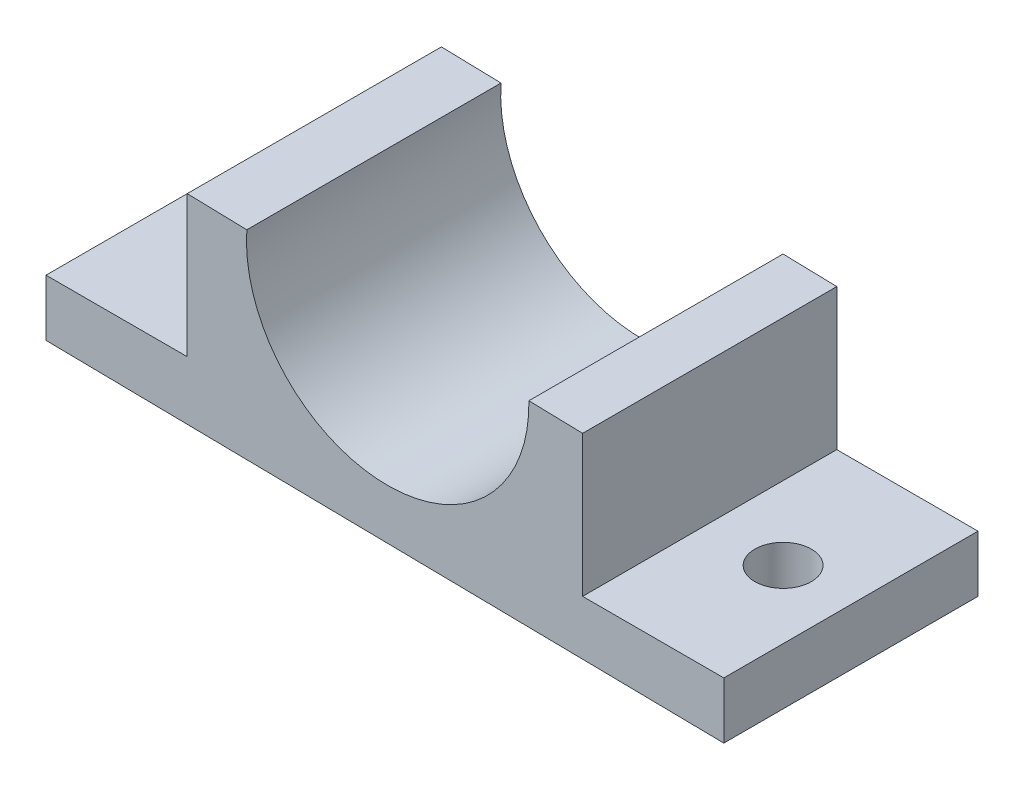
ISO-10303-21;
HEADER;
FILE_DESCRIPTION(('STEP AP214'),'2;1');
FILE_NAME('part.step','',(''),(''),'','','');
FILE_SCHEMA(('AUTOMOTIVE_DESIGN { 1 0 10303 214 1 1 1 1 }'));
ENDSEC;
DATA;
#1=APPLICATION_CONTEXT('core data for automotive mechanical design processes');
#2=APPLICATION_PROTOCOL_DEFINITION('international standard','automotive_design',2000,#1);
#3=PRODUCT_CONTEXT('',#1,'mechanical');
#4=PRODUCT('Part','Part','',(#3));
#5=PRODUCT_RELATED_PRODUCT_CATEGORY('part','',(#4));
#6=PRODUCT_DEFINITION_FORMATION('','',#4);
#7=PRODUCT_DEFINITION_CONTEXT('part definition',#1,'design');
#8=PRODUCT_DEFINITION('design','',#6,#7);
#9=PRODUCT_DEFINITION_SHAPE('','',#8);
#10=(LENGTH_UNIT() NAMED_UNIT(*) SI_UNIT(.MILLI.,.METRE.));
#11=(NAMED_UNIT(*) PLANE_ANGLE_UNIT() SI_UNIT($,.RADIAN.));
#12=(NAMED_UNIT(*) SI_UNIT($,.STERADIAN.) SOLID_ANGLE_UNIT());
#13=UNCERTAINTY_MEASURE_WITH_UNIT(LENGTH_MEASURE(1.E-05),#10,'distance_accuracy_value','');
#14=(GEOMETRIC_REPRESENTATION_CONTEXT(3) GLOBAL_UNCERTAINTY_ASSIGNED_CONTEXT((#13)) GLOBAL_UNIT_ASSIGNED_CONTEXT((#10,
#11,#12)) REPRESENTATION_CONTEXT('',''));
#15=CARTESIAN_POINT('',(0.,0.,0.));
#16=DIRECTION('',(0.,0.,1.));
#17=DIRECTION('',(1.,0.,0.));
#18=AXIS2_PLACEMENT_3D('',#15,#16,#17);
#19=CARTESIAN_POINT('',(-75.5736853515667,44.1312412812751,57.15));
#20=DIRECTION('',(0.,0.,-1.));
#21=DIRECTION('',(-1.,0.,0.));
#22=AXIS2_PLACEMENT_3D('',#19,#20,#21);
#23=CYLINDRICAL_SURFACE('',#22,31.75);
#24=CARTESIAN_POINT('',(-75.5736853515667,44.1312412812751,0.));
#25=DIRECTION('',(0.,0.,1.));
#26=DIRECTION('',(1.,0.,0.));
#27=AXIS2_PLACEMENT_3D('',#24,#25,#26);
#28=CIRCLE('',#27,31.75);
#29=CARTESIAN_POINT('',(-107.247170639037,46.3341552025226,0.));
#30=VERTEX_POINT('',#29);
#31=CARTESIAN_POINT('',(-43.8297439349851,44.7514697396948,0.));
#32=VERTEX_POINT('',#31);
#33=EDGE_CURVE('E155',#30,#32,#28,.T.);
#34=ORIENTED_EDGE('',*,*,#33,.F.);
#35=DIRECTION('',(0.,0.,-1.));
#36=VECTOR('',#35,1.);
#37=CARTESIAN_POINT('',(-107.247170639037,46.3341552025226,57.15));
#38=LINE('',#37,#36);
#39=CARTESIAN_POINT('',(-107.247170639037,46.3341552025226,57.15));
#40=VERTEX_POINT('',#39);
#41=EDGE_CURVE('E13',#40,#30,#38,.T.);
#42=ORIENTED_EDGE('',*,*,#41,.F.);
#43=CARTESIAN_POINT('',(-75.5736853515667,44.1312412812751,57.15));
#44=DIRECTION('',(0.,0.,1.));
#45=DIRECTION('',(1.,0.,0.));
#46=AXIS2_PLACEMENT_3D('',#43,#44,#45);
#47=CIRCLE('',#46,31.75);
#48=CARTESIAN_POINT('',(-43.8297439349851,44.7514697396948,57.15));
#49=VERTEX_POINT('',#48);
#50=EDGE_CURVE('E214',#40,#49,#47,.T.);
#51=ORIENTED_EDGE('',*,*,#50,.T.);
#52=DIRECTION('',(0.,0.,-1.));
#53=VECTOR('',#52,1.);
#54=CARTESIAN_POINT('',(-43.8297439349851,44.7514697396948,57.15));
#55=LINE('',#54,#53);
#56=EDGE_CURVE('E64',#49,#32,#55,.T.);
#57=ORIENTED_EDGE('',*,*,#56,.T.);
#58=EDGE_LOOP('',(#34,#42,#51,#57));
#59=FACE_BOUND('',#58,.T.);
#60=ADVANCED_FACE('F47',(#59),#23,.F.);
#61=CARTESIAN_POINT('',(1.08886920067288,43.6304523835041,57.15));
#62=DIRECTION('',(0.0249488650103552,0.999688728622412,0.));
#63=DIRECTION('',(-0.999688728622412,0.0249488650103552,0.));
#64=AXIS2_PLACEMENT_3D('',#61,#62,#63);
#65=PLANE('',#64);
#66=DIRECTION('',(0.999688728622412,-0.0249488650103552,0.));
#67=VECTOR('',#66,1.);
#68=CARTESIAN_POINT('',(1.08886920067288,43.6304523835041,0.));
#69=LINE('',#68,#67);
#70=CARTESIAN_POINT('',(-120.65,46.6686447000127,0.));
#71=VERTEX_POINT('',#70);
#72=EDGE_CURVE('E157',#71,#30,#69,.T.);
#73=ORIENTED_EDGE('',*,*,#72,.F.);
#74=DIRECTION('',(0.,0.,-1.));
#75=VECTOR('',#74,1.);
#76=CARTESIAN_POINT('',(-120.65,46.6686447000127,57.15));
#77=LINE('',#76,#75);
#78=CARTESIAN_POINT('',(-120.65,46.6686447000127,57.15));
#79=VERTEX_POINT('',#78);
#80=EDGE_CURVE('E56',#79,#71,#77,.T.);
#81=ORIENTED_EDGE('',*,*,#80,.F.);
#82=DIRECTION('',(0.999688728622412,-0.0249488650103552,0.));
#83=VECTOR('',#82,1.);
#84=CARTESIAN_POINT('',(1.08886920067288,43.6304523835041,57.15));
#85=LINE('',#84,#83);
#86=EDGE_CURVE('E152',#79,#40,#85,.T.);
#87=ORIENTED_EDGE('',*,*,#86,.T.);
#88=ORIENTED_EDGE('',*,*,#41,.T.);
#89=EDGE_LOOP('',(#73,#81,#87,#88));
#90=FACE_BOUND('',#89,.T.);
#91=ADVANCED_FACE('F199',(#90),#65,.T.);
#92=CARTESIAN_POINT('',(-120.65,0.,57.15));
#93=DIRECTION('',(-1.,0.,0.));
#94=DIRECTION('',(0.,0.,1.));
#95=AXIS2_PLACEMENT_3D('',#92,#93,#94);
#96=PLANE('',#95);
#97=DIRECTION('',(0.,1.,0.));
#98=VECTOR('',#97,1.);
#99=CARTESIAN_POINT('',(-120.65,0.,0.));
#100=LINE('',#99,#98);
#101=CARTESIAN_POINT('',(-120.65,14.9186447000127,0.));
#102=VERTEX_POINT('',#101);
#103=EDGE_CURVE('E160',#102,#71,#100,.T.);
#104=ORIENTED_EDGE('',*,*,#103,.F.);
#105=DIRECTION('',(0.,0.,-1.));
#106=VECTOR('',#105,1.);
#107=CARTESIAN_POINT('',(-120.65,14.9186447000127,57.15));
#108=LINE('',#107,#106);
#109=CARTESIAN_POINT('',(-120.65,14.9186447000127,57.15));
#110=VERTEX_POINT('',#109);
#111=EDGE_CURVE('E187',#110,#102,#108,.T.);
#112=ORIENTED_EDGE('',*,*,#111,.F.);
#113=DIRECTION('',(0.,1.,0.));
#114=VECTOR('',#113,1.);
#115=CARTESIAN_POINT('',(-120.65,0.,57.15));
#116=LINE('',#115,#114);
#117=EDGE_CURVE('E195',#110,#79,#116,.T.);
#118=ORIENTED_EDGE('',*,*,#117,.T.);
#119=ORIENTED_EDGE('',*,*,#80,.T.);
#120=EDGE_LOOP('',(#104,#112,#118,#119));
#121=FACE_BOUND('',#120,.T.);
#122=ADVANCED_FACE('F193',(#121),#96,.T.);
#123=CARTESIAN_POINT('',(0.,14.9186447000127,57.15));
#124=DIRECTION('',(0.,1.,0.));
#125=DIRECTION('',(0.,0.,1.));
#126=AXIS2_PLACEMENT_3D('',#123,#124,#125);
#127=PLANE('',#126);
#128=CARTESIAN_POINT('',(-135.898685351567,14.9186447000127,28.575));
#129=DIRECTION('',(0.,1.,0.));
#130=DIRECTION('',(0.,0.,1.));
#131=AXIS2_PLACEMENT_3D('',#128,#129,#130);
#132=CIRCLE('',#131,6.35000000000002);
#133=CARTESIAN_POINT('',(-135.898685351567,14.9186447000127,34.925));
#134=VERTEX_POINT('',#133);
#135=EDGE_CURVE('E246',#134,#134,#132,.T.);
#136=ORIENTED_EDGE('',*,*,#135,.F.);
#137=EDGE_LOOP('',(#136));
#138=FACE_BOUND('',#137,.T.);
#139=DIRECTION('',(1.,0.,0.));
#140=VECTOR('',#139,1.);
#141=CARTESIAN_POINT('',(0.,14.9186447000127,0.));
#142=LINE('',#141,#140);
#143=CARTESIAN_POINT('',(-152.4,14.9186447000127,0.));
#144=VERTEX_POINT('',#143);
#145=EDGE_CURVE('E164',#144,#102,#142,.T.);
#146=ORIENTED_EDGE('',*,*,#145,.F.);
#147=DIRECTION('',(0.,0.,-1.));
#148=VECTOR('',#147,1.);
#149=CARTESIAN_POINT('',(-152.4,14.9186447000127,57.15));
#150=LINE('',#149,#148);
#151=CARTESIAN_POINT('',(-152.4,14.9186447000127,57.15));
#152=VERTEX_POINT('',#151);
#153=EDGE_CURVE('E185',#152,#144,#150,.T.);
#154=ORIENTED_EDGE('',*,*,#153,.F.);
#155=DIRECTION('',(1.,0.,0.));
#156=VECTOR('',#155,1.);
#157=CARTESIAN_POINT('',(0.,14.9186447000127,57.15));
#158=LINE('',#157,#156);
#159=EDGE_CURVE('E208',#152,#110,#158,.T.);
#160=ORIENTED_EDGE('',*,*,#159,.T.);
#161=ORIENTED_EDGE('',*,*,#111,.T.);
#162=EDGE_LOOP('',(#146,#154,#160,#161));
#163=FACE_BOUND('',#162,.T.);
#164=ADVANCED_FACE('F205',(#138,#163),#127,.T.);
#165=CARTESIAN_POINT('',(-152.4,0.,57.15));
#166=DIRECTION('',(-1.,0.,0.));
#167=DIRECTION('',(0.,0.,1.));
#168=AXIS2_PLACEMENT_3D('',#165,#166,#167);
#169=PLANE('',#168);
#170=DIRECTION('',(0.,1.,0.));
#171=VECTOR('',#170,1.);
#172=CARTESIAN_POINT('',(-152.4,0.,0.));
#173=LINE('',#172,#171);
#174=CARTESIAN_POINT('',(-152.4,2.21864470001273,0.));
#175=VERTEX_POINT('',#174);
#176=EDGE_CURVE('E167',#175,#144,#173,.T.);
#177=ORIENTED_EDGE('',*,*,#176,.F.);
#178=DIRECTION('',(0.,0.,-1.));
#179=VECTOR('',#178,1.);
#180=CARTESIAN_POINT('',(-152.4,2.21864470001273,57.15));
#181=LINE('',#180,#179);
#182=CARTESIAN_POINT('',(-152.4,2.21864470001273,57.15));
#183=VERTEX_POINT('',#182);
#184=EDGE_CURVE('E183',#183,#175,#181,.T.);
#185=ORIENTED_EDGE('',*,*,#184,.F.);
#186=DIRECTION('',(0.,1.,0.));
#187=VECTOR('',#186,1.);
#188=CARTESIAN_POINT('',(-152.4,0.,57.15));
#189=LINE('',#188,#187);
#190=EDGE_CURVE('E212',#183,#152,#189,.T.);
#191=ORIENTED_EDGE('',*,*,#190,.T.);
#192=ORIENTED_EDGE('',*,*,#153,.T.);
#193=EDGE_LOOP('',(#177,#185,#191,#192));
#194=FACE_BOUND('',#193,.T.);
#195=ADVANCED_FACE('F224',(#194),#169,.T.);
#196=CARTESIAN_POINT('',(0.,0.,57.15));
#197=DIRECTION('',(-0.0145564936455055,-0.999894048633528,0.));
#198=DIRECTION('',(0.999894048633528,-0.0145564936455055,0.));
#199=AXIS2_PLACEMENT_3D('',#196,#197,#198);
#200=PLANE('',#199);
#201=CARTESIAN_POINT('',(-15.2486853515667,0.22199091166282,28.575));
#202=DIRECTION('',(-0.0145564936455055,-0.999894048633528,0.));
#203=DIRECTION('',(-0.999894048633528,0.0145564936455055,0.));
#204=AXIS2_PLACEMENT_3D('',#201,#202,#203);
#205=ELLIPSE('',#204,6.3506728624678,6.35);
#206=CARTESIAN_POINT('',(-21.5986853515667,0.314434440830017,28.575));
#207=VERTEX_POINT('',#206);
#208=EDGE_CURVE('E249',#207,#207,#205,.T.);
#209=ORIENTED_EDGE('',*,*,#208,.F.);
#210=EDGE_LOOP('',(#209));
#211=FACE_BOUND('',#210,.T.);
#212=CARTESIAN_POINT('',(-135.898685351567,1.97841796583957,28.575));
#213=DIRECTION('',(-0.0145564936455055,-0.999894048633528,0.));
#214=DIRECTION('',(-0.999894048633528,0.0145564936455055,0.));
#215=AXIS2_PLACEMENT_3D('',#212,#213,#214);
#216=ELLIPSE('',#215,6.35067286246782,6.35000000000002);
#217=CARTESIAN_POINT('',(-142.248685351567,2.07086149500677,28.575));
#218=VERTEX_POINT('',#217);
#219=EDGE_CURVE('E50',#218,#218,#216,.T.);
#220=ORIENTED_EDGE('',*,*,#219,.F.);
#221=EDGE_LOOP('',(#220));
#222=FACE_BOUND('',#221,.T.);
#223=DIRECTION('',(-0.999894048633528,0.0145564936455055,0.));
#224=VECTOR('',#223,1.);
#225=CARTESIAN_POINT('',(0.,0.,0.));
#226=LINE('',#225,#224);
#227=CARTESIAN_POINT('',(0.,0.,0.));
#228=VERTEX_POINT('',#227);
#229=EDGE_CURVE('E170',#228,#175,#226,.T.);
#230=ORIENTED_EDGE('',*,*,#229,.F.);
#231=DIRECTION('',(0.,0.,-1.));
#232=VECTOR('',#231,1.);
#233=CARTESIAN_POINT('',(0.,0.,57.15));
#234=LINE('',#233,#232);
#235=CARTESIAN_POINT('',(0.,0.,57.15));
#236=VERTEX_POINT('',#235);
#237=EDGE_CURVE('E181',#236,#228,#234,.T.);
#238=ORIENTED_EDGE('',*,*,#237,.F.);
#239=DIRECTION('',(-0.999894048633528,0.0145564936455055,0.));
#240=VECTOR('',#239,1.);
#241=CARTESIAN_POINT('',(0.,0.,57.15));
#242=LINE('',#241,#240);
#243=EDGE_CURVE('E218',#236,#183,#242,.T.);
#244=ORIENTED_EDGE('',*,*,#243,.T.);
#245=ORIENTED_EDGE('',*,*,#184,.T.);
#246=EDGE_LOOP('',(#230,#238,#244,#245));
#247=FACE_BOUND('',#246,.T.);
#248=ADVANCED_FACE('F222',(#211,#222,#247),#200,.T.);
#249=CARTESIAN_POINT('',(0.,0.,57.15));
#250=DIRECTION('',(-1.,0.,0.));
#251=DIRECTION('',(0.,0.,1.));
#252=AXIS2_PLACEMENT_3D('',#249,#250,#251);
#253=PLANE('',#252);
#254=DIRECTION('',(0.,1.,0.));
#255=VECTOR('',#254,1.);
#256=CARTESIAN_POINT('',(0.,0.,0.));
#257=LINE('',#256,#255);
#258=CARTESIAN_POINT('',(0.,12.7,0.));
#259=VERTEX_POINT('',#258);
#260=EDGE_CURVE('E173',#228,#259,#257,.T.);
#261=ORIENTED_EDGE('',*,*,#260,.T.);
#262=DIRECTION('',(0.,0.,-1.));
#263=VECTOR('',#262,1.);
#264=CARTESIAN_POINT('',(0.,12.7,57.15));
#265=LINE('',#264,#263);
#266=CARTESIAN_POINT('',(0.,12.7,57.15));
#267=VERTEX_POINT('',#266);
#268=EDGE_CURVE('E146',#267,#259,#265,.T.);
#269=ORIENTED_EDGE('',*,*,#268,.F.);
#270=DIRECTION('',(0.,1.,0.));
#271=VECTOR('',#270,1.);
#272=CARTESIAN_POINT('',(0.,0.,57.15));
#273=LINE('',#272,#271);
#274=EDGE_CURVE('E134',#236,#267,#273,.T.);
#275=ORIENTED_EDGE('',*,*,#274,.F.);
#276=ORIENTED_EDGE('',*,*,#237,.T.);
#277=EDGE_LOOP('',(#261,#269,#275,#276));
#278=FACE_BOUND('',#277,.T.);
#279=ADVANCED_FACE('F227',(#278),#253,.F.);
#280=CARTESIAN_POINT('',(0.,12.7,57.15));
#281=DIRECTION('',(0.,-1.,0.));
#282=DIRECTION('',(0.,0.,-1.));
#283=AXIS2_PLACEMENT_3D('',#280,#281,#282);
#284=PLANE('',#283);
#285=CARTESIAN_POINT('',(-15.2486853515667,12.7,28.575));
#286=DIRECTION('',(0.,1.,0.));
#287=DIRECTION('',(0.,0.,1.));
#288=AXIS2_PLACEMENT_3D('',#285,#286,#287);
#289=CIRCLE('',#288,6.35);
#290=CARTESIAN_POINT('',(-15.2486853515667,12.7,34.925));
#291=VERTEX_POINT('',#290);
#292=EDGE_CURVE('E252',#291,#291,#289,.T.);
#293=ORIENTED_EDGE('',*,*,#292,.F.);
#294=EDGE_LOOP('',(#293));
#295=FACE_BOUND('',#294,.T.);
#296=DIRECTION('',(-1.,0.,0.));
#297=VECTOR('',#296,1.);
#298=CARTESIAN_POINT('',(0.,12.7,0.));
#299=LINE('',#298,#297);
#300=CARTESIAN_POINT('',(-31.75,12.7,0.));
#301=VERTEX_POINT('',#300);
#302=EDGE_CURVE('E143',#259,#301,#299,.T.);
#303=ORIENTED_EDGE('',*,*,#302,.T.);
#304=DIRECTION('',(0.,0.,-1.));
#305=VECTOR('',#304,1.);
#306=CARTESIAN_POINT('',(-31.75,12.7,57.15));
#307=LINE('',#306,#305);
#308=CARTESIAN_POINT('',(-31.75,12.7,57.15));
#309=VERTEX_POINT('',#308);
#310=EDGE_CURVE('E140',#309,#301,#307,.T.);
#311=ORIENTED_EDGE('',*,*,#310,.F.);
#312=DIRECTION('',(-1.,0.,0.));
#313=VECTOR('',#312,1.);
#314=CARTESIAN_POINT('',(0.,12.7,57.15));
#315=LINE('',#314,#313);
#316=EDGE_CURVE('E126',#267,#309,#315,.T.);
#317=ORIENTED_EDGE('',*,*,#316,.F.);
#318=ORIENTED_EDGE('',*,*,#268,.T.);
#319=EDGE_LOOP('',(#303,#311,#317,#318));
#320=FACE_BOUND('',#319,.T.);
#321=ADVANCED_FACE('F141',(#295,#320),#284,.F.);
#322=CARTESIAN_POINT('',(-31.75,0.,57.15));
#323=DIRECTION('',(-1.,0.,0.));
#324=DIRECTION('',(0.,0.,1.));
#325=AXIS2_PLACEMENT_3D('',#322,#323,#324);
#326=PLANE('',#325);
#327=DIRECTION('',(0.,1.,0.));
#328=VECTOR('',#327,1.);
#329=CARTESIAN_POINT('',(-31.75,0.,0.));
#330=LINE('',#329,#328);
#331=CARTESIAN_POINT('',(-31.75,44.45,0.));
#332=VERTEX_POINT('',#331);
#333=EDGE_CURVE('E176',#301,#332,#330,.T.);
#334=ORIENTED_EDGE('',*,*,#333,.T.);
#335=DIRECTION('',(0.,0.,-1.));
#336=VECTOR('',#335,1.);
#337=CARTESIAN_POINT('',(-31.75,44.45,57.15));
#338=LINE('',#337,#336);
#339=CARTESIAN_POINT('',(-31.75,44.45,57.15));
#340=VERTEX_POINT('',#339);
#341=EDGE_CURVE('E96',#340,#332,#338,.T.);
#342=ORIENTED_EDGE('',*,*,#341,.F.);
#343=DIRECTION('',(0.,1.,0.));
#344=VECTOR('',#343,1.);
#345=CARTESIAN_POINT('',(-31.75,0.,57.15));
#346=LINE('',#345,#344);
#347=EDGE_CURVE('E131',#309,#340,#346,.T.);
#348=ORIENTED_EDGE('',*,*,#347,.F.);
#349=ORIENTED_EDGE('',*,*,#310,.T.);
#350=EDGE_LOOP('',(#334,#342,#348,#349));
#351=FACE_BOUND('',#350,.T.);
#352=ADVANCED_FACE('F148',(#351),#326,.F.);
#353=EDGE_CURVE('E161',#32,#332,#69,.T.);
#354=ORIENTED_EDGE('',*,*,#353,.F.);
#355=ORIENTED_EDGE('',*,*,#56,.F.);
#356=EDGE_CURVE('E149',#49,#340,#85,.T.);
#357=ORIENTED_EDGE('',*,*,#356,.T.);
#358=ORIENTED_EDGE('',*,*,#341,.T.);
#359=EDGE_LOOP('',(#354,#355,#357,#358));
#360=FACE_BOUND('',#359,.T.);
#361=ADVANCED_FACE('F243',(#360),#65,.T.);
#362=CARTESIAN_POINT('',(0.,0.,57.15));
#363=DIRECTION('',(0.,0.,1.));
#364=DIRECTION('',(1.,0.,0.));
#365=AXIS2_PLACEMENT_3D('',#362,#363,#364);
#366=PLANE('',#365);
#367=ORIENTED_EDGE('',*,*,#50,.F.);
#368=ORIENTED_EDGE('',*,*,#86,.F.);
#369=ORIENTED_EDGE('',*,*,#117,.F.);
#370=ORIENTED_EDGE('',*,*,#159,.F.);
#371=ORIENTED_EDGE('',*,*,#190,.F.);
#372=ORIENTED_EDGE('',*,*,#243,.F.);
#373=ORIENTED_EDGE('',*,*,#274,.T.);
#374=ORIENTED_EDGE('',*,*,#316,.T.);
#375=ORIENTED_EDGE('',*,*,#347,.T.);
#376=ORIENTED_EDGE('',*,*,#356,.F.);
#377=EDGE_LOOP('',(#367,#368,#369,#370,#371,#372,#373,#374,#375,#376));
#378=FACE_BOUND('',#377,.T.);
#379=ADVANCED_FACE('F128',(#378),#366,.T.);
#380=CARTESIAN_POINT('',(0.,0.,0.));
#381=DIRECTION('',(0.,0.,1.));
#382=DIRECTION('',(1.,0.,0.));
#383=AXIS2_PLACEMENT_3D('',#380,#381,#382);
#384=PLANE('',#383);
#385=ORIENTED_EDGE('',*,*,#33,.T.);
#386=ORIENTED_EDGE('',*,*,#353,.T.);
#387=ORIENTED_EDGE('',*,*,#333,.F.);
#388=ORIENTED_EDGE('',*,*,#302,.F.);
#389=ORIENTED_EDGE('',*,*,#260,.F.);
#390=ORIENTED_EDGE('',*,*,#229,.T.);
#391=ORIENTED_EDGE('',*,*,#176,.T.);
#392=ORIENTED_EDGE('',*,*,#145,.T.);
#393=ORIENTED_EDGE('',*,*,#103,.T.);
#394=ORIENTED_EDGE('',*,*,#72,.T.);
#395=EDGE_LOOP('',(#385,#386,#387,#388,#389,#390,#391,#392,#393,#394));
#396=FACE_BOUND('',#395,.T.);
#397=ADVANCED_FACE('F201',(#396),#384,.F.);
#398=CARTESIAN_POINT('',(-135.898685351567,-77.0293552999873,28.575));
#399=DIRECTION('',(0.,1.,0.));
#400=DIRECTION('',(0.,0.,1.));
#401=AXIS2_PLACEMENT_3D('',#398,#399,#400);
#402=CYLINDRICAL_SURFACE('',#401,6.35000000000002);
#403=ORIENTED_EDGE('',*,*,#219,.T.);
#404=EDGE_LOOP('',(#403));
#405=FACE_BOUND('',#404,.T.);
#406=ORIENTED_EDGE('',*,*,#135,.T.);
#407=EDGE_LOOP('',(#406));
#408=FACE_BOUND('',#407,.T.);
#409=ADVANCED_FACE('F258',(#405,#408),#402,.F.);
#410=CARTESIAN_POINT('',(-15.2486853515667,-79.248,28.575));
#411=DIRECTION('',(0.,1.,0.));
#412=DIRECTION('',(0.,0.,1.));
#413=AXIS2_PLACEMENT_3D('',#410,#411,#412);
#414=CYLINDRICAL_SURFACE('',#413,6.35);
#415=ORIENTED_EDGE('',*,*,#208,.T.);
#416=EDGE_LOOP('',(#415));
#417=FACE_BOUND('',#416,.T.);
#418=ORIENTED_EDGE('',*,*,#292,.T.);
#419=EDGE_LOOP('',(#418));
#420=FACE_BOUND('',#419,.T.);
#421=ADVANCED_FACE('F256',(#417,#420),#414,.F.);
#422=CLOSED_SHELL('',(#60,#91,#122,#164,#195,#248,#279,#321,#352,#361,#379,#397,#409,#421));
#423=MANIFOLD_SOLID_BREP('B2',#422);
#424=ADVANCED_BREP_SHAPE_REPRESENTATION('',(#18,#423),#14);
#425=SHAPE_DEFINITION_REPRESENTATION(#9,#424);
ENDSEC;
END-ISO-10303-21;
